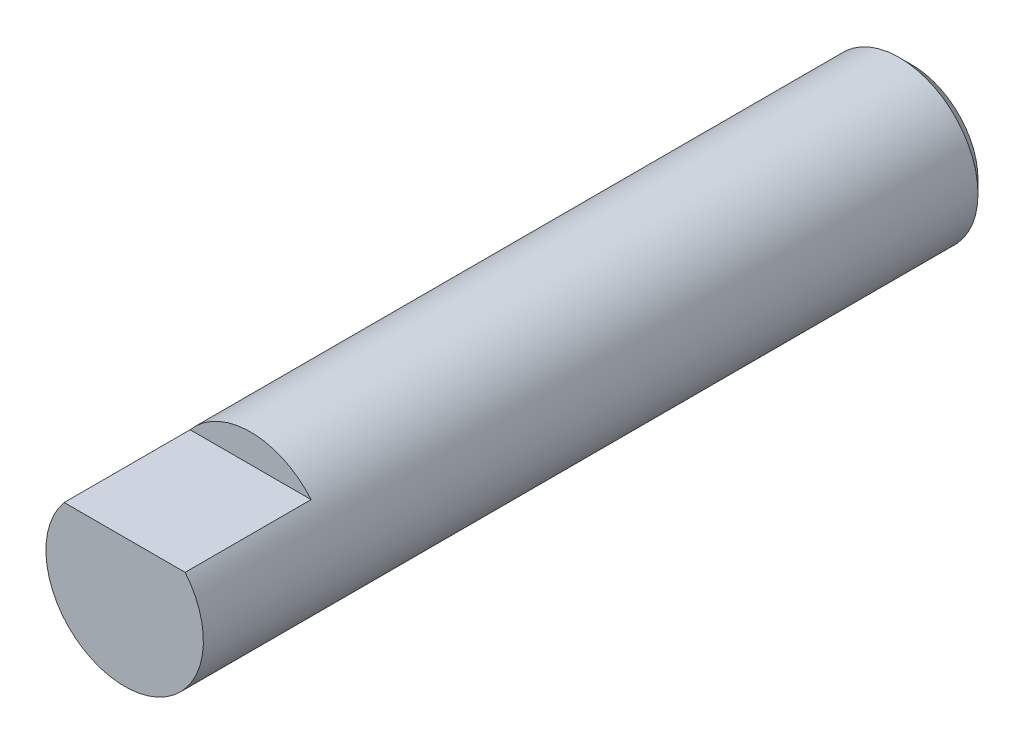
ISO-10303-21;
HEADER;
FILE_DESCRIPTION(('STEP AP214'),'2;1');
FILE_NAME('part.step','',(''),(''),'','','');
FILE_SCHEMA(('AUTOMOTIVE_DESIGN { 1 0 10303 214 1 1 1 1 }'));
ENDSEC;
DATA;
#1=APPLICATION_CONTEXT('core data for automotive mechanical design processes');
#2=APPLICATION_PROTOCOL_DEFINITION('international standard','automotive_design',2000,#1);
#3=PRODUCT_CONTEXT('',#1,'mechanical');
#4=PRODUCT('Part','Part','',(#3));
#5=PRODUCT_RELATED_PRODUCT_CATEGORY('part','',(#4));
#6=PRODUCT_DEFINITION_FORMATION('','',#4);
#7=PRODUCT_DEFINITION_CONTEXT('part definition',#1,'design');
#8=PRODUCT_DEFINITION('design','',#6,#7);
#9=PRODUCT_DEFINITION_SHAPE('','',#8);
#10=(LENGTH_UNIT() NAMED_UNIT(*) SI_UNIT(.MILLI.,.METRE.));
#11=(NAMED_UNIT(*) PLANE_ANGLE_UNIT() SI_UNIT($,.RADIAN.));
#12=(NAMED_UNIT(*) SI_UNIT($,.STERADIAN.) SOLID_ANGLE_UNIT());
#13=UNCERTAINTY_MEASURE_WITH_UNIT(LENGTH_MEASURE(1.E-05),#10,'distance_accuracy_value','');
#14=(GEOMETRIC_REPRESENTATION_CONTEXT(3) GLOBAL_UNCERTAINTY_ASSIGNED_CONTEXT((#13)) GLOBAL_UNIT_ASSIGNED_CONTEXT((#10,
#11,#12)) REPRESENTATION_CONTEXT('',''));
#15=CARTESIAN_POINT('',(0.,0.,0.));
#16=DIRECTION('',(0.,0.,1.));
#17=DIRECTION('',(1.,0.,0.));
#18=AXIS2_PLACEMENT_3D('',#15,#16,#17);
#19=CARTESIAN_POINT('',(0.,0.,125.));
#20=DIRECTION('',(0.,0.,-1.));
#21=DIRECTION('',(-1.,0.,0.));
#22=AXIS2_PLACEMENT_3D('',#19,#20,#21);
#23=CYLINDRICAL_SURFACE('',#22,12.5);
#24=CARTESIAN_POINT('',(0.,0.,1.99999999999997));
#25=DIRECTION('',(0.,0.,1.));
#26=DIRECTION('',(1.,0.,0.));
#27=AXIS2_PLACEMENT_3D('',#24,#25,#26);
#28=CIRCLE('',#27,12.5);
#29=CARTESIAN_POINT('',(12.5,0.,1.99999999999997));
#30=VERTEX_POINT('',#29);
#31=EDGE_CURVE('E57',#30,#30,#28,.T.);
#32=ORIENTED_EDGE('',*,*,#31,.T.);
#33=EDGE_LOOP('',(#32));
#34=FACE_BOUND('',#33,.T.);
#35=CARTESIAN_POINT('',(0.,0.,125.));
#36=DIRECTION('',(0.,0.,1.));
#37=DIRECTION('',(1.,0.,0.));
#38=AXIS2_PLACEMENT_3D('',#35,#36,#37);
#39=CIRCLE('',#38,12.5);
#40=CARTESIAN_POINT('',(-9.60468635614927,8.,125.));
#41=VERTEX_POINT('',#40);
#42=CARTESIAN_POINT('',(9.60468635614927,8.,125.));
#43=VERTEX_POINT('',#42);
#44=EDGE_CURVE('E85',#41,#43,#39,.T.);
#45=ORIENTED_EDGE('',*,*,#44,.F.);
#46=DIRECTION('',(0.,0.,1.));
#47=VECTOR('',#46,1.);
#48=CARTESIAN_POINT('',(-9.60468635614927,8.,105.));
#49=LINE('',#48,#47);
#50=CARTESIAN_POINT('',(-9.60468635614927,8.,105.));
#51=VERTEX_POINT('',#50);
#52=EDGE_CURVE('E64',#51,#41,#49,.T.);
#53=ORIENTED_EDGE('',*,*,#52,.F.);
#54=CARTESIAN_POINT('',(0.,0.,105.));
#55=DIRECTION('',(0.,0.,1.));
#56=DIRECTION('',(1.,0.,0.));
#57=AXIS2_PLACEMENT_3D('',#54,#55,#56);
#58=CIRCLE('',#57,12.5);
#59=CARTESIAN_POINT('',(9.60468635614927,8.,105.));
#60=VERTEX_POINT('',#59);
#61=EDGE_CURVE('E81',#60,#51,#58,.T.);
#62=ORIENTED_EDGE('',*,*,#61,.F.);
#63=DIRECTION('',(0.,0.,1.));
#64=VECTOR('',#63,1.);
#65=CARTESIAN_POINT('',(9.60468635614927,8.,105.));
#66=LINE('',#65,#64);
#67=EDGE_CURVE('E70',#60,#43,#66,.T.);
#68=ORIENTED_EDGE('',*,*,#67,.T.);
#69=EDGE_LOOP('',(#45,#53,#62,#68));
#70=FACE_BOUND('',#69,.T.);
#71=ADVANCED_FACE('F47',(#34,#70),#23,.T.);
#72=CARTESIAN_POINT('',(0.,0.,125.));
#73=DIRECTION('',(0.,0.,1.));
#74=DIRECTION('',(1.,0.,0.));
#75=AXIS2_PLACEMENT_3D('',#72,#73,#74);
#76=PLANE('',#75);
#77=DIRECTION('',(1.,0.,0.));
#78=VECTOR('',#77,1.);
#79=CARTESIAN_POINT('',(-9.60468635614927,8.,125.));
#80=LINE('',#79,#78);
#81=EDGE_CURVE('E75',#41,#43,#80,.T.);
#82=ORIENTED_EDGE('',*,*,#81,.F.);
#83=ORIENTED_EDGE('',*,*,#44,.T.);
#84=EDGE_LOOP('',(#82,#83));
#85=FACE_BOUND('',#84,.T.);
#86=ADVANCED_FACE('F88',(#85),#76,.T.);
#87=CARTESIAN_POINT('',(0.,0.,0.));
#88=DIRECTION('',(0.,0.,1.));
#89=DIRECTION('',(1.,0.,0.));
#90=AXIS2_PLACEMENT_3D('',#87,#88,#89);
#91=PLANE('',#90);
#92=CARTESIAN_POINT('',(0.,0.,0.));
#93=DIRECTION('',(0.,0.,1.));
#94=DIRECTION('',(1.,0.,0.));
#95=AXIS2_PLACEMENT_3D('',#92,#93,#94);
#96=CIRCLE('',#95,10.5);
#97=CARTESIAN_POINT('',(10.5,0.,0.));
#98=VERTEX_POINT('',#97);
#99=EDGE_CURVE('E11',#98,#98,#96,.F.);
#100=ORIENTED_EDGE('',*,*,#99,.T.);
#101=EDGE_LOOP('',(#100));
#102=FACE_BOUND('',#101,.T.);
#103=ADVANCED_FACE('F110',(#102),#91,.F.);
#104=CARTESIAN_POINT('',(-9.60468635614927,8.,105.));
#105=DIRECTION('',(0.,-1.,0.));
#106=DIRECTION('',(0.,0.,-1.));
#107=AXIS2_PLACEMENT_3D('',#104,#105,#106);
#108=PLANE('',#107);
#109=ORIENTED_EDGE('',*,*,#81,.T.);
#110=ORIENTED_EDGE('',*,*,#67,.F.);
#111=DIRECTION('',(1.,0.,0.));
#112=VECTOR('',#111,1.);
#113=CARTESIAN_POINT('',(-9.60468635614927,8.,105.));
#114=LINE('',#113,#112);
#115=EDGE_CURVE('E95',#51,#60,#114,.T.);
#116=ORIENTED_EDGE('',*,*,#115,.F.);
#117=ORIENTED_EDGE('',*,*,#52,.T.);
#118=EDGE_LOOP('',(#109,#110,#116,#117));
#119=FACE_BOUND('',#118,.T.);
#120=ADVANCED_FACE('F76',(#119),#108,.F.);
#121=CARTESIAN_POINT('',(0.,0.,105.));
#122=DIRECTION('',(0.,0.,1.));
#123=DIRECTION('',(1.,0.,0.));
#124=AXIS2_PLACEMENT_3D('',#121,#122,#123);
#125=PLANE('',#124);
#126=ORIENTED_EDGE('',*,*,#61,.T.);
#127=ORIENTED_EDGE('',*,*,#115,.T.);
#128=EDGE_LOOP('',(#126,#127));
#129=FACE_BOUND('',#128,.T.);
#130=ADVANCED_FACE('F101',(#129),#125,.T.);
#131=CARTESIAN_POINT('',(0.,0.,1.99999999999997));
#132=DIRECTION('',(0.,0.,1.));
#133=DIRECTION('',(1.,0.,0.));
#134=AXIS2_PLACEMENT_3D('',#131,#132,#133);
#135=CONICAL_SURFACE('',#134,12.5,0.785398163397453);
#136=ORIENTED_EDGE('',*,*,#99,.F.);
#137=EDGE_LOOP('',(#136));
#138=FACE_BOUND('',#137,.T.);
#139=ORIENTED_EDGE('',*,*,#31,.F.);
#140=EDGE_LOOP('',(#139));
#141=FACE_BOUND('',#140,.T.);
#142=ADVANCED_FACE('F50',(#138,#141),#135,.T.);
#143=CLOSED_SHELL('',(#71,#86,#103,#120,#130,#142));
#144=MANIFOLD_SOLID_BREP('B2',#143);
#145=ADVANCED_BREP_SHAPE_REPRESENTATION('',(#18,#144),#14);
#146=SHAPE_DEFINITION_REPRESENTATION(#9,#145);
ENDSEC;
END-ISO-10303-21;
